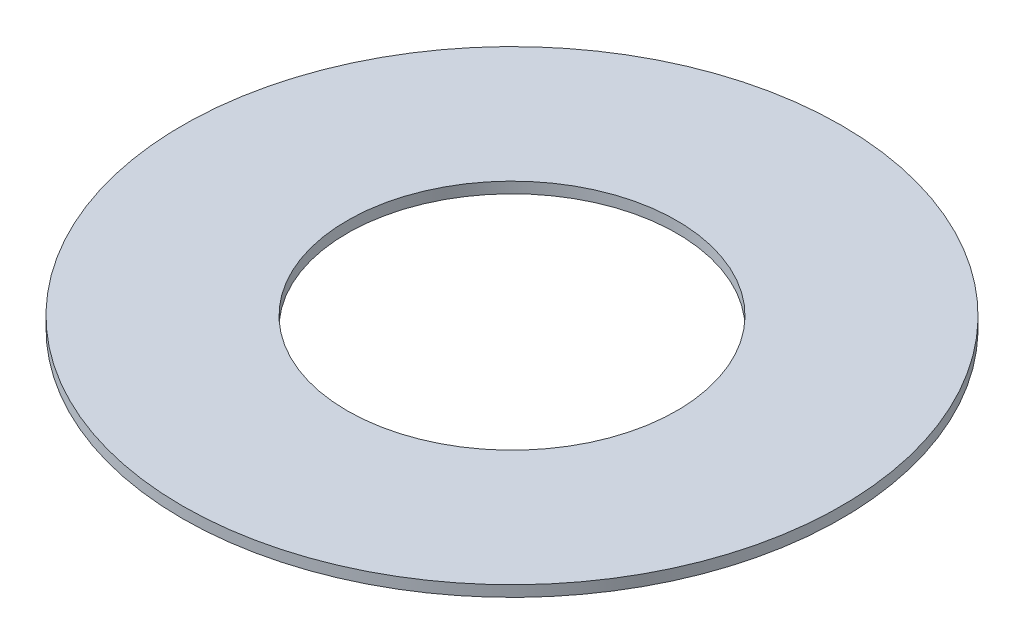
ISO-10303-21;
HEADER;
FILE_DESCRIPTION(('STEP AP214'),'2;1');
FILE_NAME('part.step','',(''),(''),'','','');
FILE_SCHEMA(('AUTOMOTIVE_DESIGN { 1 0 10303 214 1 1 1 1 }'));
ENDSEC;
DATA;
#1=APPLICATION_CONTEXT('core data for automotive mechanical design processes');
#2=APPLICATION_PROTOCOL_DEFINITION('international standard','automotive_design',2000,#1);
#3=PRODUCT_CONTEXT('',#1,'mechanical');
#4=PRODUCT('Part','Part','',(#3));
#5=PRODUCT_RELATED_PRODUCT_CATEGORY('part','',(#4));
#6=PRODUCT_DEFINITION_FORMATION('','',#4);
#7=PRODUCT_DEFINITION_CONTEXT('part definition',#1,'design');
#8=PRODUCT_DEFINITION('design','',#6,#7);
#9=PRODUCT_DEFINITION_SHAPE('','',#8);
#10=(LENGTH_UNIT() NAMED_UNIT(*) SI_UNIT(.MILLI.,.METRE.));
#11=(NAMED_UNIT(*) PLANE_ANGLE_UNIT() SI_UNIT($,.RADIAN.));
#12=(NAMED_UNIT(*) SI_UNIT($,.STERADIAN.) SOLID_ANGLE_UNIT());
#13=UNCERTAINTY_MEASURE_WITH_UNIT(LENGTH_MEASURE(1.E-05),#10,'distance_accuracy_value','');
#14=(GEOMETRIC_REPRESENTATION_CONTEXT(3) GLOBAL_UNCERTAINTY_ASSIGNED_CONTEXT((#13)) GLOBAL_UNIT_ASSIGNED_CONTEXT((#10,
#11,#12)) REPRESENTATION_CONTEXT('',''));
#15=CARTESIAN_POINT('',(0.,0.,0.));
#16=DIRECTION('',(0.,0.,1.));
#17=DIRECTION('',(1.,0.,0.));
#18=AXIS2_PLACEMENT_3D('',#15,#16,#17);
#19=CARTESIAN_POINT('',(0.,0.199999999999978,0.));
#20=DIRECTION('',(0.,-1.,0.));
#21=DIRECTION('',(0.,0.,-1.));
#22=AXIS2_PLACEMENT_3D('',#19,#20,#21);
#23=CYLINDRICAL_SURFACE('',#22,6.);
#24=CARTESIAN_POINT('',(0.,0.199999999999978,0.));
#25=DIRECTION('',(0.,1.,0.));
#26=DIRECTION('',(0.,0.,1.));
#27=AXIS2_PLACEMENT_3D('',#24,#25,#26);
#28=CIRCLE('',#27,6.);
#29=CARTESIAN_POINT('',(0.,0.199999999999978,-6.));
#30=VERTEX_POINT('',#29);
#31=EDGE_CURVE('E10',#30,#30,#28,.T.);
#32=CARTESIAN_POINT('',(0.,0.,0.));
#33=DIRECTION('',(0.,1.,0.));
#34=DIRECTION('',(0.,0.,1.));
#35=AXIS2_PLACEMENT_3D('',#32,#33,#34);
#36=CIRCLE('',#35,6.);
#37=CARTESIAN_POINT('',(0.,0.,-6.));
#38=VERTEX_POINT('',#37);
#39=EDGE_CURVE('E40',#38,#38,#36,.T.);
#40=CARTESIAN_POINT('',(0.,0.199999999999978,-6.));
#41=CARTESIAN_POINT('',(0.,0.197916666666645,-6.));
#42=CARTESIAN_POINT('',(0.,0.195833333333312,-6.));
#43=CARTESIAN_POINT('',(0.,0.191666666666646,-6.));
#44=CARTESIAN_POINT('',(0.,0.189583333333312,-6.));
#45=CARTESIAN_POINT('',(0.,0.185416666666646,-6.));
#46=CARTESIAN_POINT('',(0.,0.183333333333313,-6.));
#47=CARTESIAN_POINT('',(0.,0.179166666666647,-6.));
#48=CARTESIAN_POINT('',(0.,0.177083333333314,-6.));
#49=CARTESIAN_POINT('',(0.,0.172916666666648,-6.));
#50=CARTESIAN_POINT('',(0.,0.170833333333315,-6.));
#51=CARTESIAN_POINT('',(0.,0.166666666666648,-6.));
#52=CARTESIAN_POINT('',(0.,0.164583333333315,-6.));
#53=CARTESIAN_POINT('',(0.,0.160416666666649,-6.));
#54=CARTESIAN_POINT('',(0.,0.158333333333316,-6.));
#55=CARTESIAN_POINT('',(0.,0.15416666666665,-6.));
#56=CARTESIAN_POINT('',(0.,0.152083333333317,-6.));
#57=CARTESIAN_POINT('',(0.,0.14791666666665,-6.));
#58=CARTESIAN_POINT('',(0.,0.145833333333317,-6.));
#59=CARTESIAN_POINT('',(0.,0.141666666666651,-6.));
#60=CARTESIAN_POINT('',(0.,0.139583333333318,-6.));
#61=CARTESIAN_POINT('',(0.,0.135416666666652,-6.));
#62=CARTESIAN_POINT('',(0.,0.133333333333319,-6.));
#63=CARTESIAN_POINT('',(0.,0.129166666666652,-6.));
#64=CARTESIAN_POINT('',(0.,0.127083333333319,-6.));
#65=CARTESIAN_POINT('',(0.,0.122916666666653,-6.));
#66=CARTESIAN_POINT('',(0.,0.12083333333332,-6.));
#67=CARTESIAN_POINT('',(0.,0.116666666666654,-6.));
#68=CARTESIAN_POINT('',(0.,0.114583333333321,-6.));
#69=CARTESIAN_POINT('',(0.,0.110416666666654,-6.));
#70=CARTESIAN_POINT('',(0.,0.108333333333321,-6.));
#71=CARTESIAN_POINT('',(0.,0.104166666666655,-6.));
#72=CARTESIAN_POINT('',(0.,0.102083333333322,-6.));
#73=CARTESIAN_POINT('',(0.,0.0979166666666559,-6.));
#74=CARTESIAN_POINT('',(0.,0.0958333333333228,-6.));
#75=CARTESIAN_POINT('',(0.,0.0916666666666566,-6.));
#76=CARTESIAN_POINT('',(0.,0.0895833333333235,-6.));
#77=CARTESIAN_POINT('',(0.,0.0854166666666573,-6.));
#78=CARTESIAN_POINT('',(0.,0.0833333333333242,-6.));
#79=CARTESIAN_POINT('',(0.,0.0791666666666579,-6.));
#80=CARTESIAN_POINT('',(0.,0.0770833333333248,-6.));
#81=CARTESIAN_POINT('',(0.,0.0729166666666586,-6.));
#82=CARTESIAN_POINT('',(0.,0.0708333333333255,-6.));
#83=CARTESIAN_POINT('',(0.,0.0666666666666593,-6.));
#84=CARTESIAN_POINT('',(0.,0.0645833333333262,-6.));
#85=CARTESIAN_POINT('',(0.,0.06041666666666,-6.));
#86=CARTESIAN_POINT('',(0.,0.0583333333333269,-6.));
#87=CARTESIAN_POINT('',(0.,0.0541666666666607,-6.));
#88=CARTESIAN_POINT('',(0.,0.0520833333333276,-6.));
#89=CARTESIAN_POINT('',(0.,0.0479166666666614,-6.));
#90=CARTESIAN_POINT('',(0.,0.0458333333333283,-6.));
#91=CARTESIAN_POINT('',(0.,0.041666666666662,-6.));
#92=CARTESIAN_POINT('',(0.,0.0395833333333289,-6.));
#93=CARTESIAN_POINT('',(0.,0.0354166666666627,-6.));
#94=CARTESIAN_POINT('',(0.,0.0333333333333296,-6.));
#95=CARTESIAN_POINT('',(0.,0.0291666666666634,-6.));
#96=CARTESIAN_POINT('',(0.,0.0270833333333303,-6.));
#97=CARTESIAN_POINT('',(0.,0.0229166666666641,-6.));
#98=CARTESIAN_POINT('',(0.,0.020833333333331,-6.));
#99=CARTESIAN_POINT('',(0.,0.0166666666666648,-6.));
#100=CARTESIAN_POINT('',(0.,0.0145833333333317,-6.));
#101=CARTESIAN_POINT('',(0.,0.0104166666666655,-6.));
#102=CARTESIAN_POINT('',(0.,0.00833333333333241,-6.));
#103=CARTESIAN_POINT('',(0.,0.00416666666666621,-6.));
#104=CARTESIAN_POINT('',(0.,0.00208333333333311,-6.));
#105=CARTESIAN_POINT('',(0.,0.,-6.));
#106=B_SPLINE_CURVE_WITH_KNOTS('',3,(#40,#41,#42,#43,#44,#45,#46,#47,#48,#49,#50,#51,#52,#53,
#54,#55,#56,#57,#58,#59,#60,#61,#62,#63,#64,#65,#66,#67,#68,#69,#70,#71,#72,#73,#74,#75,#76,#77,
#78,#79,#80,#81,#82,#83,#84,#85,#86,#87,#88,#89,#90,#91,#92,#93,#94,#95,#96,#97,#98,#99,#100,
#101,#102,#103,#104,#105),.UNSPECIFIED.,.F.,.F.,(4,2,2,2,2,2,2,2,2,2,2,2,2,2,2,2,2,2,2,2,2,2,2,
2,2,2,2,2,2,2,2,2,4),(0.,0.00624999999999931,0.0124999999999986,0.0187499999999979,
0.0249999999999972,0.0312499999999966,0.0374999999999959,0.0437499999999952,0.0499999999999945,
0.0562499999999938,0.0624999999999931,0.0687499999999924,0.0749999999999917,0.0812499999999911,
0.0874999999999904,0.0937499999999897,0.099999999999989,0.106249999999988,0.112499999999988,
0.118749999999987,0.124999999999986,0.131249999999986,0.137499999999985,0.143749999999984,
0.149999999999984,0.156249999999983,0.162499999999982,0.168749999999981,0.174999999999981,
0.18124999999998,0.187499999999979,0.193749999999979,0.199999999999978),.UNSPECIFIED.);
#107=EDGE_CURVE('BSEAM37',#30,#38,#106,.T.);
#108=ORIENTED_EDGE('',*,*,#31,.F.);
#109=ORIENTED_EDGE('',*,*,#39,.T.);
#110=ORIENTED_EDGE('',*,*,#107,.T.);
#111=ORIENTED_EDGE('',*,*,#107,.F.);
#112=EDGE_LOOP('',(#108,#110,#109,#111));
#113=FACE_BOUND('',#112,.T.);
#114=ADVANCED_FACE('F37',(#113),#23,.T.);
#115=CARTESIAN_POINT('',(0.,0.199999999999978,0.));
#116=DIRECTION('',(0.,1.,0.));
#117=DIRECTION('',(0.,0.,1.));
#118=AXIS2_PLACEMENT_3D('',#115,#116,#117);
#119=PLANE('',#118);
#120=CARTESIAN_POINT('',(0.,0.199999999999978,0.));
#121=DIRECTION('',(0.,1.,0.));
#122=DIRECTION('',(0.,0.,1.));
#123=AXIS2_PLACEMENT_3D('',#120,#121,#122);
#124=CIRCLE('',#123,3.);
#125=CARTESIAN_POINT('',(0.,0.199999999999978,3.));
#126=VERTEX_POINT('',#125);
#127=EDGE_CURVE('E49',#126,#126,#124,.T.);
#128=ORIENTED_EDGE('',*,*,#127,.F.);
#129=EDGE_LOOP('',(#128));
#130=FACE_BOUND('',#129,.T.);
#131=ORIENTED_EDGE('',*,*,#31,.T.);
#132=EDGE_LOOP('',(#131));
#133=FACE_BOUND('',#132,.T.);
#134=ADVANCED_FACE('F64',(#130,#133),#119,.T.);
#135=CARTESIAN_POINT('',(0.,0.,0.));
#136=DIRECTION('',(0.,1.,0.));
#137=DIRECTION('',(0.,0.,1.));
#138=AXIS2_PLACEMENT_3D('',#135,#136,#137);
#139=PLANE('',#138);
#140=CARTESIAN_POINT('',(0.,0.,0.));
#141=DIRECTION('',(0.,1.,0.));
#142=DIRECTION('',(0.,0.,1.));
#143=AXIS2_PLACEMENT_3D('',#140,#141,#142);
#144=CIRCLE('',#143,3.);
#145=CARTESIAN_POINT('',(0.,0.,3.));
#146=VERTEX_POINT('',#145);
#147=EDGE_CURVE('E47',#146,#146,#144,.T.);
#148=ORIENTED_EDGE('',*,*,#147,.T.);
#149=EDGE_LOOP('',(#148));
#150=FACE_BOUND('',#149,.T.);
#151=ORIENTED_EDGE('',*,*,#39,.F.);
#152=EDGE_LOOP('',(#151));
#153=FACE_BOUND('',#152,.T.);
#154=ADVANCED_FACE('F55',(#150,#153),#139,.F.);
#155=CARTESIAN_POINT('',(0.,0.,0.));
#156=DIRECTION('',(0.,1.,0.));
#157=DIRECTION('',(0.,0.,1.));
#158=AXIS2_PLACEMENT_3D('',#155,#156,#157);
#159=CYLINDRICAL_SURFACE('',#158,3.);
#160=CARTESIAN_POINT('',(0.,0.,3.));
#161=CARTESIAN_POINT('',(0.,0.0020833333333331,3.));
#162=CARTESIAN_POINT('',(0.,0.00416666666666621,3.));
#163=CARTESIAN_POINT('',(0.,0.00833333333333242,3.));
#164=CARTESIAN_POINT('',(0.,0.0104166666666655,3.));
#165=CARTESIAN_POINT('',(0.,0.0145833333333317,3.));
#166=CARTESIAN_POINT('',(0.,0.0166666666666648,3.));
#167=CARTESIAN_POINT('',(0.,0.020833333333331,3.));
#168=CARTESIAN_POINT('',(0.,0.0229166666666641,3.));
#169=CARTESIAN_POINT('',(0.,0.0270833333333304,3.));
#170=CARTESIAN_POINT('',(0.,0.0291666666666635,3.));
#171=CARTESIAN_POINT('',(0.,0.0333333333333297,3.));
#172=CARTESIAN_POINT('',(0.,0.0354166666666628,3.));
#173=CARTESIAN_POINT('',(0.,0.039583333333329,3.));
#174=CARTESIAN_POINT('',(0.,0.0416666666666621,3.));
#175=CARTESIAN_POINT('',(0.,0.0458333333333283,3.));
#176=CARTESIAN_POINT('',(0.,0.0479166666666614,3.));
#177=CARTESIAN_POINT('',(0.,0.0520833333333276,3.));
#178=CARTESIAN_POINT('',(0.,0.0541666666666607,3.));
#179=CARTESIAN_POINT('',(0.,0.0583333333333269,3.));
#180=CARTESIAN_POINT('',(0.,0.06041666666666,3.));
#181=CARTESIAN_POINT('',(0.,0.0645833333333262,3.));
#182=CARTESIAN_POINT('',(0.,0.0666666666666593,3.));
#183=CARTESIAN_POINT('',(0.,0.0708333333333255,3.));
#184=CARTESIAN_POINT('',(0.,0.0729166666666586,3.));
#185=CARTESIAN_POINT('',(0.,0.0770833333333249,3.));
#186=CARTESIAN_POINT('',(0.,0.079166666666658,3.));
#187=CARTESIAN_POINT('',(0.,0.0833333333333242,3.));
#188=CARTESIAN_POINT('',(0.,0.0854166666666573,3.));
#189=CARTESIAN_POINT('',(0.,0.0895833333333235,3.));
#190=CARTESIAN_POINT('',(0.,0.0916666666666566,3.));
#191=CARTESIAN_POINT('',(0.,0.0958333333333228,3.));
#192=CARTESIAN_POINT('',(0.,0.0979166666666559,3.));
#193=CARTESIAN_POINT('',(0.,0.102083333333322,3.));
#194=CARTESIAN_POINT('',(0.,0.104166666666655,3.));
#195=CARTESIAN_POINT('',(0.,0.108333333333321,3.));
#196=CARTESIAN_POINT('',(0.,0.110416666666655,3.));
#197=CARTESIAN_POINT('',(0.,0.114583333333321,3.));
#198=CARTESIAN_POINT('',(0.,0.116666666666654,3.));
#199=CARTESIAN_POINT('',(0.,0.12083333333332,3.));
#200=CARTESIAN_POINT('',(0.,0.122916666666653,3.));
#201=CARTESIAN_POINT('',(0.,0.127083333333319,3.));
#202=CARTESIAN_POINT('',(0.,0.129166666666652,3.));
#203=CARTESIAN_POINT('',(0.,0.133333333333319,3.));
#204=CARTESIAN_POINT('',(0.,0.135416666666652,3.));
#205=CARTESIAN_POINT('',(0.,0.139583333333318,3.));
#206=CARTESIAN_POINT('',(0.,0.141666666666651,3.));
#207=CARTESIAN_POINT('',(0.,0.145833333333317,3.));
#208=CARTESIAN_POINT('',(0.,0.14791666666665,3.));
#209=CARTESIAN_POINT('',(0.,0.152083333333317,3.));
#210=CARTESIAN_POINT('',(0.,0.15416666666665,3.));
#211=CARTESIAN_POINT('',(0.,0.158333333333316,3.));
#212=CARTESIAN_POINT('',(0.,0.160416666666649,3.));
#213=CARTESIAN_POINT('',(0.,0.164583333333315,3.));
#214=CARTESIAN_POINT('',(0.,0.166666666666648,3.));
#215=CARTESIAN_POINT('',(0.,0.170833333333315,3.));
#216=CARTESIAN_POINT('',(0.,0.172916666666648,3.));
#217=CARTESIAN_POINT('',(0.,0.177083333333314,3.));
#218=CARTESIAN_POINT('',(0.,0.179166666666647,3.));
#219=CARTESIAN_POINT('',(0.,0.183333333333313,3.));
#220=CARTESIAN_POINT('',(0.,0.185416666666646,3.));
#221=CARTESIAN_POINT('',(0.,0.189583333333312,3.));
#222=CARTESIAN_POINT('',(0.,0.191666666666646,3.));
#223=CARTESIAN_POINT('',(0.,0.195833333333312,3.));
#224=CARTESIAN_POINT('',(0.,0.197916666666645,3.));
#225=CARTESIAN_POINT('',(0.,0.199999999999978,3.));
#226=B_SPLINE_CURVE_WITH_KNOTS('',3,(#160,#161,#162,#163,#164,#165,#166,#167,#168,#169,#170,
#171,#172,#173,#174,#175,#176,#177,#178,#179,#180,#181,#182,#183,#184,#185,#186,#187,#188,#189,
#190,#191,#192,#193,#194,#195,#196,#197,#198,#199,#200,#201,#202,#203,#204,#205,#206,#207,#208,
#209,#210,#211,#212,#213,#214,#215,#216,#217,#218,#219,#220,#221,#222,#223,#224,#225),
.UNSPECIFIED.,.F.,.F.,(4,2,2,2,2,2,2,2,2,2,2,2,2,2,2,2,2,2,2,2,2,2,2,2,2,2,2,2,2,2,2,2,4),(0.,
0.00624999999999931,0.0124999999999986,0.0187499999999979,0.0249999999999972,0.0312499999999966,
0.0374999999999959,0.0437499999999952,0.0499999999999945,0.0562499999999938,0.0624999999999931,
0.0687499999999924,0.0749999999999918,0.0812499999999911,0.0874999999999904,0.0937499999999897,
0.099999999999989,0.106249999999988,0.112499999999988,0.118749999999987,0.124999999999986,
0.131249999999986,0.137499999999985,0.143749999999984,0.149999999999984,0.156249999999983,
0.162499999999982,0.168749999999981,0.174999999999981,0.18124999999998,0.187499999999979,
0.193749999999979,0.199999999999978),.UNSPECIFIED.);
#227=EDGE_CURVE('BSEAM58',#146,#126,#226,.T.);
#228=ORIENTED_EDGE('',*,*,#147,.F.);
#229=ORIENTED_EDGE('',*,*,#127,.T.);
#230=ORIENTED_EDGE('',*,*,#227,.T.);
#231=ORIENTED_EDGE('',*,*,#227,.F.);
#232=EDGE_LOOP('',(#228,#230,#229,#231));
#233=FACE_BOUND('',#232,.T.);
#234=ADVANCED_FACE('F58',(#233),#159,.F.);
#235=CLOSED_SHELL('',(#114,#134,#154,#234));
#236=MANIFOLD_SOLID_BREP('B2',#235);
#237=ADVANCED_BREP_SHAPE_REPRESENTATION('',(#18,#236),#14);
#238=SHAPE_DEFINITION_REPRESENTATION(#9,#237);
ENDSEC;
END-ISO-10303-21;
